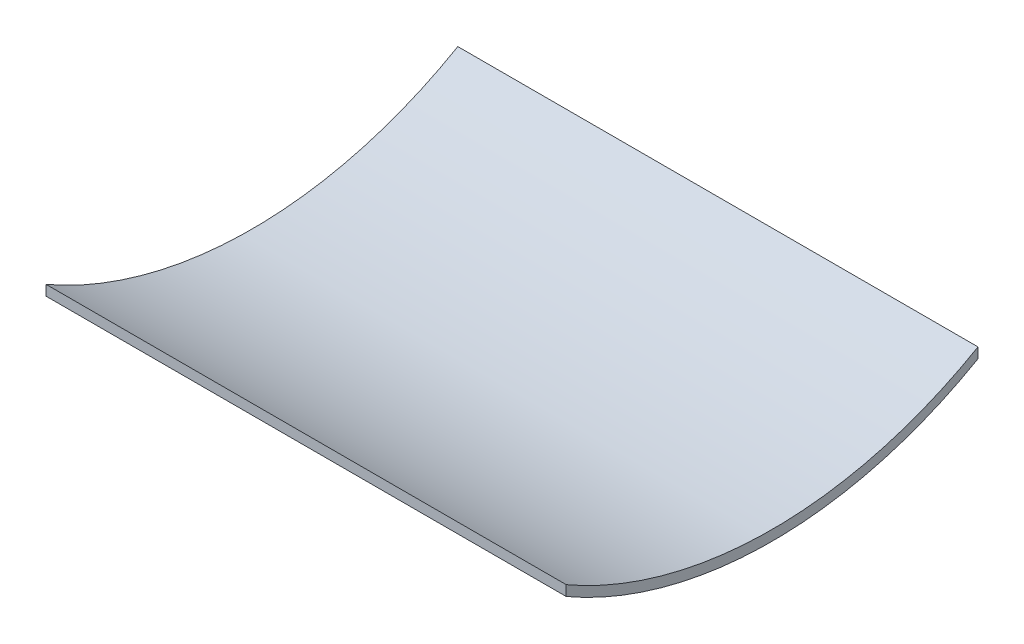
ISO-10303-21;
HEADER;
FILE_DESCRIPTION(('STEP AP214'),'2;1');
FILE_NAME('part.step','',(''),(''),'','','');
FILE_SCHEMA(('AUTOMOTIVE_DESIGN { 1 0 10303 214 1 1 1 1 }'));
ENDSEC;
DATA;
#1=APPLICATION_CONTEXT('core data for automotive mechanical design processes');
#2=APPLICATION_PROTOCOL_DEFINITION('international standard','automotive_design',2000,#1);
#3=PRODUCT_CONTEXT('',#1,'mechanical');
#4=PRODUCT('Part','Part','',(#3));
#5=PRODUCT_RELATED_PRODUCT_CATEGORY('part','',(#4));
#6=PRODUCT_DEFINITION_FORMATION('','',#4);
#7=PRODUCT_DEFINITION_CONTEXT('part definition',#1,'design');
#8=PRODUCT_DEFINITION('design','',#6,#7);
#9=PRODUCT_DEFINITION_SHAPE('','',#8);
#10=(LENGTH_UNIT() NAMED_UNIT(*) SI_UNIT(.MILLI.,.METRE.));
#11=(NAMED_UNIT(*) PLANE_ANGLE_UNIT() SI_UNIT($,.RADIAN.));
#12=(NAMED_UNIT(*) SI_UNIT($,.STERADIAN.) SOLID_ANGLE_UNIT());
#13=UNCERTAINTY_MEASURE_WITH_UNIT(LENGTH_MEASURE(1.E-05),#10,'distance_accuracy_value','');
#14=(GEOMETRIC_REPRESENTATION_CONTEXT(3) GLOBAL_UNCERTAINTY_ASSIGNED_CONTEXT((#13)) GLOBAL_UNIT_ASSIGNED_CONTEXT((#10,
#11,#12)) REPRESENTATION_CONTEXT('',''));
#15=CARTESIAN_POINT('',(0.,0.,0.));
#16=DIRECTION('',(0.,0.,1.));
#17=DIRECTION('',(1.,0.,0.));
#18=AXIS2_PLACEMENT_3D('',#15,#16,#17);
#19=CARTESIAN_POINT('',(304.8,0.,8.39330504044901));
#20=DIRECTION('',(0.,0.,-1.));
#21=DIRECTION('',(-1.,0.,0.));
#22=AXIS2_PLACEMENT_3D('',#19,#20,#21);
#23=PLANE('',#22);
#24=DIRECTION('',(0.,-1.,0.));
#25=VECTOR('',#24,1.);
#26=CARTESIAN_POINT('',(0.,0.,8.39330504044901));
#27=LINE('',#26,#25);
#28=CARTESIAN_POINT('',(0.,1.96135458454661,8.39330504044901));
#29=VERTEX_POINT('',#28);
#30=CARTESIAN_POINT('',(0.,-4.05204158897623,8.39330504044901));
#31=VERTEX_POINT('',#30);
#32=EDGE_CURVE('E102',#29,#31,#27,.T.);
#33=ORIENTED_EDGE('',*,*,#32,.T.);
#34=DIRECTION('',(-1.,0.,0.));
#35=VECTOR('',#34,1.);
#36=CARTESIAN_POINT('',(304.8,-4.05204158897623,8.39330504044901));
#37=LINE('',#36,#35);
#38=CARTESIAN_POINT('',(304.8,-4.05204158897623,8.39330504044901));
#39=VERTEX_POINT('',#38);
#40=EDGE_CURVE('E11',#39,#31,#37,.T.);
#41=ORIENTED_EDGE('',*,*,#40,.F.);
#42=DIRECTION('',(0.,-1.,0.));
#43=VECTOR('',#42,1.);
#44=CARTESIAN_POINT('',(304.8,0.,8.39330504044901));
#45=LINE('',#44,#43);
#46=CARTESIAN_POINT('',(304.8,1.96135458454661,8.39330504044901));
#47=VERTEX_POINT('',#46);
#48=EDGE_CURVE('E88',#47,#39,#45,.T.);
#49=ORIENTED_EDGE('',*,*,#48,.F.);
#50=DIRECTION('',(-1.,0.,0.));
#51=VECTOR('',#50,1.);
#52=CARTESIAN_POINT('',(304.8,1.96135458454661,8.39330504044901));
#53=LINE('',#52,#51);
#54=EDGE_CURVE('E55',#47,#29,#53,.T.);
#55=ORIENTED_EDGE('',*,*,#54,.T.);
#56=EDGE_LOOP('',(#33,#41,#49,#55));
#57=FACE_BOUND('',#56,.T.);
#58=ADVANCED_FACE('F39',(#57),#23,.F.);
#59=CARTESIAN_POINT('',(304.8,204.919888344209,-112.256694959551));
#60=DIRECTION('',(-1.,0.,0.));
#61=DIRECTION('',(0.,0.,1.));
#62=AXIS2_PLACEMENT_3D('',#59,#60,#61);
#63=CYLINDRICAL_SURFACE('',#62,241.3);
#64=CARTESIAN_POINT('',(0.,204.919888344209,-112.256694959551));
#65=DIRECTION('',(1.,0.,0.));
#66=DIRECTION('',(0.,0.,-1.));
#67=AXIS2_PLACEMENT_3D('',#64,#65,#66);
#68=CIRCLE('',#67,241.3);
#69=CARTESIAN_POINT('',(0.,-4.05204158897623,-232.906694959551));
#70=VERTEX_POINT('',#69);
#71=EDGE_CURVE('E93',#31,#70,#68,.T.);
#72=ORIENTED_EDGE('',*,*,#71,.T.);
#73=DIRECTION('',(-1.,0.,0.));
#74=VECTOR('',#73,1.);
#75=CARTESIAN_POINT('',(304.8,-4.05204158897623,-232.906694959551));
#76=LINE('',#75,#74);
#77=CARTESIAN_POINT('',(304.8,-4.05204158897623,-232.906694959551));
#78=VERTEX_POINT('',#77);
#79=EDGE_CURVE('E47',#78,#70,#76,.T.);
#80=ORIENTED_EDGE('',*,*,#79,.F.);
#81=CARTESIAN_POINT('',(304.8,204.919888344209,-112.256694959551));
#82=DIRECTION('',(1.,0.,0.));
#83=DIRECTION('',(0.,0.,-1.));
#84=AXIS2_PLACEMENT_3D('',#81,#82,#83);
#85=CIRCLE('',#84,241.3);
#86=EDGE_CURVE('E81',#39,#78,#85,.T.);
#87=ORIENTED_EDGE('',*,*,#86,.F.);
#88=ORIENTED_EDGE('',*,*,#40,.T.);
#89=EDGE_LOOP('',(#72,#80,#87,#88));
#90=FACE_BOUND('',#89,.T.);
#91=ADVANCED_FACE('F92',(#90),#63,.T.);
#92=CARTESIAN_POINT('',(304.8,0.,-232.906694959551));
#93=DIRECTION('',(0.,0.,1.));
#94=DIRECTION('',(1.,0.,0.));
#95=AXIS2_PLACEMENT_3D('',#92,#93,#94);
#96=PLANE('',#95);
#97=DIRECTION('',(0.,1.,0.));
#98=VECTOR('',#97,1.);
#99=CARTESIAN_POINT('',(0.,0.,-232.906694959551));
#100=LINE('',#99,#98);
#101=CARTESIAN_POINT('',(0.,1.96135458454661,-232.906694959551));
#102=VERTEX_POINT('',#101);
#103=EDGE_CURVE('E105',#70,#102,#100,.T.);
#104=ORIENTED_EDGE('',*,*,#103,.T.);
#105=DIRECTION('',(-1.,0.,0.));
#106=VECTOR('',#105,1.);
#107=CARTESIAN_POINT('',(304.8,1.96135458454661,-232.906694959551));
#108=LINE('',#107,#106);
#109=CARTESIAN_POINT('',(304.8,1.96135458454661,-232.906694959551));
#110=VERTEX_POINT('',#109);
#111=EDGE_CURVE('E70',#110,#102,#108,.T.);
#112=ORIENTED_EDGE('',*,*,#111,.F.);
#113=DIRECTION('',(0.,1.,0.));
#114=VECTOR('',#113,1.);
#115=CARTESIAN_POINT('',(304.8,0.,-232.906694959551));
#116=LINE('',#115,#114);
#117=EDGE_CURVE('E87',#78,#110,#116,.T.);
#118=ORIENTED_EDGE('',*,*,#117,.F.);
#119=ORIENTED_EDGE('',*,*,#79,.T.);
#120=EDGE_LOOP('',(#104,#112,#118,#119));
#121=FACE_BOUND('',#120,.T.);
#122=ADVANCED_FACE('F96',(#121),#96,.F.);
#123=CARTESIAN_POINT('',(304.8,210.933284517732,-112.256694959551));
#124=DIRECTION('',(-1.,0.,0.));
#125=DIRECTION('',(0.,0.,1.));
#126=AXIS2_PLACEMENT_3D('',#123,#124,#125);
#127=CYLINDRICAL_SURFACE('',#126,241.3);
#128=CARTESIAN_POINT('',(0.,210.933284517732,-112.256694959551));
#129=DIRECTION('',(1.,0.,0.));
#130=DIRECTION('',(0.,0.,-1.));
#131=AXIS2_PLACEMENT_3D('',#128,#129,#130);
#132=CIRCLE('',#131,241.3);
#133=EDGE_CURVE('E107',#29,#102,#132,.T.);
#134=ORIENTED_EDGE('',*,*,#133,.F.);
#135=ORIENTED_EDGE('',*,*,#54,.F.);
#136=CARTESIAN_POINT('',(304.8,210.933284517732,-112.256694959551));
#137=DIRECTION('',(1.,0.,0.));
#138=DIRECTION('',(0.,0.,-1.));
#139=AXIS2_PLACEMENT_3D('',#136,#137,#138);
#140=CIRCLE('',#139,241.3);
#141=EDGE_CURVE('E97',#47,#110,#140,.T.);
#142=ORIENTED_EDGE('',*,*,#141,.T.);
#143=ORIENTED_EDGE('',*,*,#111,.T.);
#144=EDGE_LOOP('',(#134,#135,#142,#143));
#145=FACE_BOUND('',#144,.T.);
#146=ADVANCED_FACE('F113',(#145),#127,.F.);
#147=CARTESIAN_POINT('',(304.8,0.,0.));
#148=DIRECTION('',(1.,0.,0.));
#149=DIRECTION('',(0.,0.,-1.));
#150=AXIS2_PLACEMENT_3D('',#147,#148,#149);
#151=PLANE('',#150);
#152=ORIENTED_EDGE('',*,*,#48,.T.);
#153=ORIENTED_EDGE('',*,*,#86,.T.);
#154=ORIENTED_EDGE('',*,*,#117,.T.);
#155=ORIENTED_EDGE('',*,*,#141,.F.);
#156=EDGE_LOOP('',(#152,#153,#154,#155));
#157=FACE_BOUND('',#156,.T.);
#158=ADVANCED_FACE('F84',(#157),#151,.T.);
#159=CARTESIAN_POINT('',(0.,0.,0.));
#160=DIRECTION('',(1.,0.,0.));
#161=DIRECTION('',(0.,0.,-1.));
#162=AXIS2_PLACEMENT_3D('',#159,#160,#161);
#163=PLANE('',#162);
#164=ORIENTED_EDGE('',*,*,#32,.F.);
#165=ORIENTED_EDGE('',*,*,#133,.T.);
#166=ORIENTED_EDGE('',*,*,#103,.F.);
#167=ORIENTED_EDGE('',*,*,#71,.F.);
#168=EDGE_LOOP('',(#164,#165,#166,#167));
#169=FACE_BOUND('',#168,.T.);
#170=ADVANCED_FACE('F112',(#169),#163,.F.);
#171=CLOSED_SHELL('',(#58,#91,#122,#146,#158,#170));
#172=MANIFOLD_SOLID_BREP('B2',#171);
#173=ADVANCED_BREP_SHAPE_REPRESENTATION('',(#18,#172),#14);
#174=SHAPE_DEFINITION_REPRESENTATION(#9,#173);
ENDSEC;
END-ISO-10303-21;
